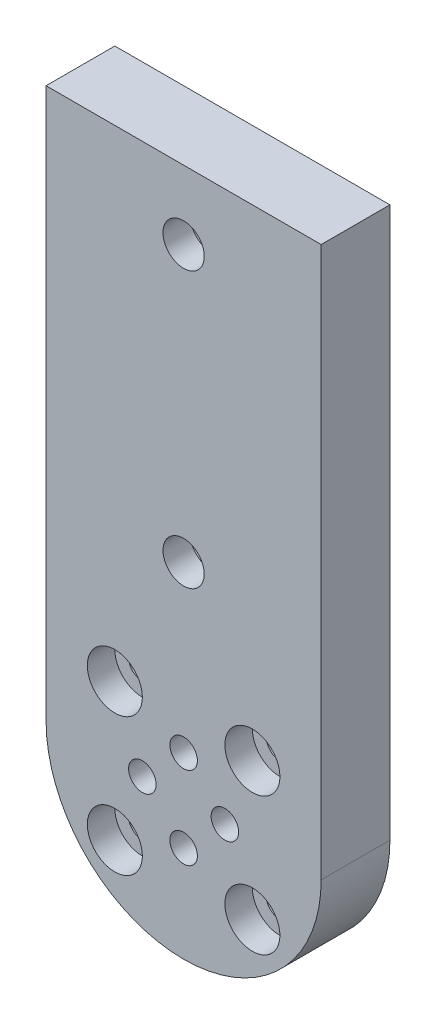
ISO-10303-21;
HEADER;
FILE_DESCRIPTION(('STEP AP214'),'2;1');
FILE_NAME('part.step','',(''),(''),'','','');
FILE_SCHEMA(('AUTOMOTIVE_DESIGN { 1 0 10303 214 1 1 1 1 }'));
ENDSEC;
DATA;
#1=APPLICATION_CONTEXT('core data for automotive mechanical design processes');
#2=APPLICATION_PROTOCOL_DEFINITION('international standard','automotive_design',2000,#1);
#3=PRODUCT_CONTEXT('',#1,'mechanical');
#4=PRODUCT('Part','Part','',(#3));
#5=PRODUCT_RELATED_PRODUCT_CATEGORY('part','',(#4));
#6=PRODUCT_DEFINITION_FORMATION('','',#4);
#7=PRODUCT_DEFINITION_CONTEXT('part definition',#1,'design');
#8=PRODUCT_DEFINITION('design','',#6,#7);
#9=PRODUCT_DEFINITION_SHAPE('','',#8);
#10=(LENGTH_UNIT() NAMED_UNIT(*) SI_UNIT(.MILLI.,.METRE.));
#11=(NAMED_UNIT(*) PLANE_ANGLE_UNIT() SI_UNIT($,.RADIAN.));
#12=(NAMED_UNIT(*) SI_UNIT($,.STERADIAN.) SOLID_ANGLE_UNIT());
#13=UNCERTAINTY_MEASURE_WITH_UNIT(LENGTH_MEASURE(1.E-05),#10,'distance_accuracy_value','');
#14=(GEOMETRIC_REPRESENTATION_CONTEXT(3) GLOBAL_UNCERTAINTY_ASSIGNED_CONTEXT((#13)) GLOBAL_UNIT_ASSIGNED_CONTEXT((#10,
#11,#12)) REPRESENTATION_CONTEXT('',''));
#15=CARTESIAN_POINT('',(0.,0.,0.));
#16=DIRECTION('',(0.,0.,1.));
#17=DIRECTION('',(1.,0.,0.));
#18=AXIS2_PLACEMENT_3D('',#15,#16,#17);
#19=CARTESIAN_POINT('',(0.,15.,5.));
#20=DIRECTION('',(0.,0.,-1.));
#21=DIRECTION('',(-1.,0.,0.));
#22=AXIS2_PLACEMENT_3D('',#19,#20,#21);
#23=CYLINDRICAL_SURFACE('',#22,1.5);
#24=CARTESIAN_POINT('',(0.,15.,5.));
#25=DIRECTION('',(0.,0.,1.));
#26=DIRECTION('',(1.,0.,0.));
#27=AXIS2_PLACEMENT_3D('',#24,#25,#26);
#28=CIRCLE('',#27,1.5);
#29=CARTESIAN_POINT('',(1.5,15.,5.));
#30=VERTEX_POINT('',#29);
#31=EDGE_CURVE('E104',#30,#30,#28,.T.);
#32=ORIENTED_EDGE('',*,*,#31,.T.);
#33=EDGE_LOOP('',(#32));
#34=FACE_BOUND('',#33,.T.);
#35=CARTESIAN_POINT('',(0.,15.,3.));
#36=DIRECTION('',(0.,0.,-1.));
#37=DIRECTION('',(-1.,0.,0.));
#38=AXIS2_PLACEMENT_3D('',#35,#36,#37);
#39=CIRCLE('',#38,1.5);
#40=CARTESIAN_POINT('',(-1.5,15.,3.));
#41=VERTEX_POINT('',#40);
#42=EDGE_CURVE('E43',#41,#41,#39,.T.);
#43=ORIENTED_EDGE('',*,*,#42,.T.);
#44=EDGE_LOOP('',(#43));
#45=FACE_BOUND('',#44,.T.);
#46=ADVANCED_FACE('F39',(#34,#45),#23,.F.);
#47=CARTESIAN_POINT('',(0.,35.,5.));
#48=DIRECTION('',(0.,0.,-1.));
#49=DIRECTION('',(-1.,0.,0.));
#50=AXIS2_PLACEMENT_3D('',#47,#48,#49);
#51=CYLINDRICAL_SURFACE('',#50,1.5);
#52=CARTESIAN_POINT('',(0.,35.,5.));
#53=DIRECTION('',(0.,0.,1.));
#54=DIRECTION('',(1.,0.,0.));
#55=AXIS2_PLACEMENT_3D('',#52,#53,#54);
#56=CIRCLE('',#55,1.5);
#57=CARTESIAN_POINT('',(1.5,35.,5.));
#58=VERTEX_POINT('',#57);
#59=EDGE_CURVE('E110',#58,#58,#56,.T.);
#60=ORIENTED_EDGE('',*,*,#59,.T.);
#61=EDGE_LOOP('',(#60));
#62=FACE_BOUND('',#61,.T.);
#63=CARTESIAN_POINT('',(0.,35.,3.));
#64=DIRECTION('',(0.,0.,-1.));
#65=DIRECTION('',(-1.,0.,0.));
#66=AXIS2_PLACEMENT_3D('',#63,#64,#65);
#67=CIRCLE('',#66,1.5);
#68=CARTESIAN_POINT('',(-1.5,35.,3.));
#69=VERTEX_POINT('',#68);
#70=EDGE_CURVE('E147',#69,#69,#67,.T.);
#71=ORIENTED_EDGE('',*,*,#70,.T.);
#72=EDGE_LOOP('',(#71));
#73=FACE_BOUND('',#72,.T.);
#74=ADVANCED_FACE('F234',(#62,#73),#51,.F.);
#75=CARTESIAN_POINT('',(-5.,5.,5.));
#76=DIRECTION('',(0.,0.,-1.));
#77=DIRECTION('',(-1.,0.,0.));
#78=AXIS2_PLACEMENT_3D('',#75,#76,#77);
#79=CYLINDRICAL_SURFACE('',#78,1.);
#80=CARTESIAN_POINT('',(-5.,5.,0.));
#81=DIRECTION('',(0.,0.,1.));
#82=DIRECTION('',(1.,0.,0.));
#83=AXIS2_PLACEMENT_3D('',#80,#81,#82);
#84=CIRCLE('',#83,1.);
#85=CARTESIAN_POINT('',(-4.,5.,0.));
#86=VERTEX_POINT('',#85);
#87=EDGE_CURVE('E123',#86,#86,#84,.T.);
#88=ORIENTED_EDGE('',*,*,#87,.F.);
#89=EDGE_LOOP('',(#88));
#90=FACE_BOUND('',#89,.T.);
#91=CARTESIAN_POINT('',(-5.,5.,3.));
#92=DIRECTION('',(0.,0.,1.));
#93=DIRECTION('',(1.,0.,0.));
#94=AXIS2_PLACEMENT_3D('',#91,#92,#93);
#95=CIRCLE('',#94,1.);
#96=CARTESIAN_POINT('',(-4.,5.,3.));
#97=VERTEX_POINT('',#96);
#98=EDGE_CURVE('E117',#97,#97,#95,.T.);
#99=ORIENTED_EDGE('',*,*,#98,.T.);
#100=EDGE_LOOP('',(#99));
#101=FACE_BOUND('',#100,.T.);
#102=ADVANCED_FACE('F241',(#90,#101),#79,.F.);
#103=CARTESIAN_POINT('',(5.,5.,5.));
#104=DIRECTION('',(0.,0.,-1.));
#105=DIRECTION('',(-1.,0.,0.));
#106=AXIS2_PLACEMENT_3D('',#103,#104,#105);
#107=CYLINDRICAL_SURFACE('',#106,1.);
#108=CARTESIAN_POINT('',(5.,5.,0.));
#109=DIRECTION('',(0.,0.,1.));
#110=DIRECTION('',(1.,0.,0.));
#111=AXIS2_PLACEMENT_3D('',#108,#109,#110);
#112=CIRCLE('',#111,1.);
#113=CARTESIAN_POINT('',(6.,5.,0.));
#114=VERTEX_POINT('',#113);
#115=EDGE_CURVE('E120',#114,#114,#112,.T.);
#116=ORIENTED_EDGE('',*,*,#115,.F.);
#117=EDGE_LOOP('',(#116));
#118=FACE_BOUND('',#117,.T.);
#119=CARTESIAN_POINT('',(5.,5.,3.));
#120=DIRECTION('',(0.,0.,1.));
#121=DIRECTION('',(1.,0.,0.));
#122=AXIS2_PLACEMENT_3D('',#119,#120,#121);
#123=CIRCLE('',#122,1.);
#124=CARTESIAN_POINT('',(6.,5.,3.));
#125=VERTEX_POINT('',#124);
#126=EDGE_CURVE('E143',#125,#125,#123,.T.);
#127=ORIENTED_EDGE('',*,*,#126,.T.);
#128=EDGE_LOOP('',(#127));
#129=FACE_BOUND('',#128,.T.);
#130=ADVANCED_FACE('F255',(#118,#129),#107,.F.);
#131=CARTESIAN_POINT('',(-5.,-5.,5.));
#132=DIRECTION('',(0.,0.,-1.));
#133=DIRECTION('',(-1.,0.,0.));
#134=AXIS2_PLACEMENT_3D('',#131,#132,#133);
#135=CYLINDRICAL_SURFACE('',#134,1.);
#136=CARTESIAN_POINT('',(-5.,-5.,0.));
#137=DIRECTION('',(0.,0.,1.));
#138=DIRECTION('',(1.,0.,0.));
#139=AXIS2_PLACEMENT_3D('',#136,#137,#138);
#140=CIRCLE('',#139,1.);
#141=CARTESIAN_POINT('',(-4.,-5.,0.));
#142=VERTEX_POINT('',#141);
#143=EDGE_CURVE('E116',#142,#142,#140,.T.);
#144=ORIENTED_EDGE('',*,*,#143,.F.);
#145=EDGE_LOOP('',(#144));
#146=FACE_BOUND('',#145,.T.);
#147=CARTESIAN_POINT('',(-5.,-5.,3.));
#148=DIRECTION('',(0.,0.,1.));
#149=DIRECTION('',(1.,0.,0.));
#150=AXIS2_PLACEMENT_3D('',#147,#148,#149);
#151=CIRCLE('',#150,1.);
#152=CARTESIAN_POINT('',(-4.,-5.,3.));
#153=VERTEX_POINT('',#152);
#154=EDGE_CURVE('E139',#153,#153,#151,.T.);
#155=ORIENTED_EDGE('',*,*,#154,.T.);
#156=EDGE_LOOP('',(#155));
#157=FACE_BOUND('',#156,.T.);
#158=ADVANCED_FACE('F258',(#146,#157),#135,.F.);
#159=CARTESIAN_POINT('',(5.,-5.,5.));
#160=DIRECTION('',(0.,0.,-1.));
#161=DIRECTION('',(-1.,0.,0.));
#162=AXIS2_PLACEMENT_3D('',#159,#160,#161);
#163=CYLINDRICAL_SURFACE('',#162,1.);
#164=CARTESIAN_POINT('',(5.,-5.,0.));
#165=DIRECTION('',(0.,0.,1.));
#166=DIRECTION('',(1.,0.,0.));
#167=AXIS2_PLACEMENT_3D('',#164,#165,#166);
#168=CIRCLE('',#167,1.);
#169=CARTESIAN_POINT('',(6.,-5.,0.));
#170=VERTEX_POINT('',#169);
#171=EDGE_CURVE('E113',#170,#170,#168,.T.);
#172=ORIENTED_EDGE('',*,*,#171,.F.);
#173=EDGE_LOOP('',(#172));
#174=FACE_BOUND('',#173,.T.);
#175=CARTESIAN_POINT('',(5.,-5.,3.));
#176=DIRECTION('',(0.,0.,1.));
#177=DIRECTION('',(1.,0.,0.));
#178=AXIS2_PLACEMENT_3D('',#175,#176,#177);
#179=CIRCLE('',#178,1.);
#180=CARTESIAN_POINT('',(6.,-5.,3.));
#181=VERTEX_POINT('',#180);
#182=EDGE_CURVE('E136',#181,#181,#179,.T.);
#183=ORIENTED_EDGE('',*,*,#182,.T.);
#184=EDGE_LOOP('',(#183));
#185=FACE_BOUND('',#184,.T.);
#186=ADVANCED_FACE('F41',(#174,#185),#163,.F.);
#187=CARTESIAN_POINT('',(0.,0.,5.));
#188=DIRECTION('',(0.,0.,-1.));
#189=DIRECTION('',(-1.,0.,0.));
#190=AXIS2_PLACEMENT_3D('',#187,#188,#189);
#191=CYLINDRICAL_SURFACE('',#190,10.);
#192=CARTESIAN_POINT('',(0.,0.,0.));
#193=DIRECTION('',(0.,0.,1.));
#194=DIRECTION('',(1.,0.,0.));
#195=AXIS2_PLACEMENT_3D('',#192,#193,#194);
#196=CIRCLE('',#195,10.);
#197=CARTESIAN_POINT('',(-10.,0.,0.));
#198=VERTEX_POINT('',#197);
#199=CARTESIAN_POINT('',(10.,0.,0.));
#200=VERTEX_POINT('',#199);
#201=EDGE_CURVE('E126',#198,#200,#196,.T.);
#202=ORIENTED_EDGE('',*,*,#201,.T.);
#203=DIRECTION('',(0.,0.,-1.));
#204=VECTOR('',#203,1.);
#205=CARTESIAN_POINT('',(10.,0.,5.));
#206=LINE('',#205,#204);
#207=CARTESIAN_POINT('',(10.,0.,5.));
#208=VERTEX_POINT('',#207);
#209=EDGE_CURVE('E11',#208,#200,#206,.T.);
#210=ORIENTED_EDGE('',*,*,#209,.F.);
#211=CARTESIAN_POINT('',(0.,0.,5.));
#212=DIRECTION('',(0.,0.,1.));
#213=DIRECTION('',(1.,0.,0.));
#214=AXIS2_PLACEMENT_3D('',#211,#212,#213);
#215=CIRCLE('',#214,10.);
#216=CARTESIAN_POINT('',(-10.,0.,5.));
#217=VERTEX_POINT('',#216);
#218=EDGE_CURVE('E92',#217,#208,#215,.T.);
#219=ORIENTED_EDGE('',*,*,#218,.F.);
#220=DIRECTION('',(0.,0.,-1.));
#221=VECTOR('',#220,1.);
#222=CARTESIAN_POINT('',(-10.,0.,5.));
#223=LINE('',#222,#221);
#224=EDGE_CURVE('E58',#217,#198,#223,.T.);
#225=ORIENTED_EDGE('',*,*,#224,.T.);
#226=EDGE_LOOP('',(#202,#210,#219,#225));
#227=FACE_BOUND('',#226,.T.);
#228=ADVANCED_FACE('F250',(#227),#191,.T.);
#229=CARTESIAN_POINT('',(10.,0.,5.));
#230=DIRECTION('',(-1.,0.,0.));
#231=DIRECTION('',(0.,0.,1.));
#232=AXIS2_PLACEMENT_3D('',#229,#230,#231);
#233=PLANE('',#232);
#234=DIRECTION('',(0.,1.,0.));
#235=VECTOR('',#234,1.);
#236=CARTESIAN_POINT('',(10.,0.,0.));
#237=LINE('',#236,#235);
#238=CARTESIAN_POINT('',(10.,40.,0.));
#239=VERTEX_POINT('',#238);
#240=EDGE_CURVE('E97',#200,#239,#237,.T.);
#241=ORIENTED_EDGE('',*,*,#240,.T.);
#242=DIRECTION('',(0.,0.,-1.));
#243=VECTOR('',#242,1.);
#244=CARTESIAN_POINT('',(10.,40.,5.));
#245=LINE('',#244,#243);
#246=CARTESIAN_POINT('',(10.,40.,5.));
#247=VERTEX_POINT('',#246);
#248=EDGE_CURVE('E49',#247,#239,#245,.T.);
#249=ORIENTED_EDGE('',*,*,#248,.F.);
#250=DIRECTION('',(0.,1.,0.));
#251=VECTOR('',#250,1.);
#252=CARTESIAN_POINT('',(10.,0.,5.));
#253=LINE('',#252,#251);
#254=EDGE_CURVE('E83',#208,#247,#253,.T.);
#255=ORIENTED_EDGE('',*,*,#254,.F.);
#256=ORIENTED_EDGE('',*,*,#209,.T.);
#257=EDGE_LOOP('',(#241,#249,#255,#256));
#258=FACE_BOUND('',#257,.T.);
#259=ADVANCED_FACE('F96',(#258),#233,.F.);
#260=CARTESIAN_POINT('',(0.,40.,5.));
#261=DIRECTION('',(0.,1.,0.));
#262=DIRECTION('',(0.,0.,1.));
#263=AXIS2_PLACEMENT_3D('',#260,#261,#262);
#264=PLANE('',#263);
#265=DIRECTION('',(1.,0.,0.));
#266=VECTOR('',#265,1.);
#267=CARTESIAN_POINT('',(0.,40.,0.));
#268=LINE('',#267,#266);
#269=CARTESIAN_POINT('',(-10.,40.,0.));
#270=VERTEX_POINT('',#269);
#271=EDGE_CURVE('E129',#270,#239,#268,.T.);
#272=ORIENTED_EDGE('',*,*,#271,.F.);
#273=DIRECTION('',(0.,0.,-1.));
#274=VECTOR('',#273,1.);
#275=CARTESIAN_POINT('',(-10.,40.,5.));
#276=LINE('',#275,#274);
#277=CARTESIAN_POINT('',(-10.,40.,5.));
#278=VERTEX_POINT('',#277);
#279=EDGE_CURVE('E72',#278,#270,#276,.T.);
#280=ORIENTED_EDGE('',*,*,#279,.F.);
#281=DIRECTION('',(1.,0.,0.));
#282=VECTOR('',#281,1.);
#283=CARTESIAN_POINT('',(0.,40.,5.));
#284=LINE('',#283,#282);
#285=EDGE_CURVE('E91',#278,#247,#284,.T.);
#286=ORIENTED_EDGE('',*,*,#285,.T.);
#287=ORIENTED_EDGE('',*,*,#248,.T.);
#288=EDGE_LOOP('',(#272,#280,#286,#287));
#289=FACE_BOUND('',#288,.T.);
#290=ADVANCED_FACE('F101',(#289),#264,.T.);
#291=CARTESIAN_POINT('',(-10.,0.,5.));
#292=DIRECTION('',(-1.,0.,0.));
#293=DIRECTION('',(0.,0.,1.));
#294=AXIS2_PLACEMENT_3D('',#291,#292,#293);
#295=PLANE('',#294);
#296=DIRECTION('',(0.,1.,0.));
#297=VECTOR('',#296,1.);
#298=CARTESIAN_POINT('',(-10.,0.,0.));
#299=LINE('',#298,#297);
#300=EDGE_CURVE('E131',#198,#270,#299,.T.);
#301=ORIENTED_EDGE('',*,*,#300,.F.);
#302=ORIENTED_EDGE('',*,*,#224,.F.);
#303=DIRECTION('',(0.,1.,0.));
#304=VECTOR('',#303,1.);
#305=CARTESIAN_POINT('',(-10.,0.,5.));
#306=LINE('',#305,#304);
#307=EDGE_CURVE('E102',#217,#278,#306,.T.);
#308=ORIENTED_EDGE('',*,*,#307,.T.);
#309=ORIENTED_EDGE('',*,*,#279,.T.);
#310=EDGE_LOOP('',(#301,#302,#308,#309));
#311=FACE_BOUND('',#310,.T.);
#312=ADVANCED_FACE('F219',(#311),#295,.T.);
#313=CARTESIAN_POINT('',(0.,0.,5.));
#314=DIRECTION('',(0.,0.,1.));
#315=DIRECTION('',(1.,0.,0.));
#316=AXIS2_PLACEMENT_3D('',#313,#314,#315);
#317=PLANE('',#316);
#318=CARTESIAN_POINT('',(5.,5.,5.));
#319=DIRECTION('',(0.,0.,1.));
#320=DIRECTION('',(1.,0.,0.));
#321=AXIS2_PLACEMENT_3D('',#318,#319,#320);
#322=CIRCLE('',#321,2.);
#323=CARTESIAN_POINT('',(7.,5.,5.));
#324=VERTEX_POINT('',#323);
#325=EDGE_CURVE('E186',#324,#324,#322,.T.);
#326=ORIENTED_EDGE('',*,*,#325,.F.);
#327=EDGE_LOOP('',(#326));
#328=FACE_BOUND('',#327,.T.);
#329=CARTESIAN_POINT('',(5.,-5.,5.));
#330=DIRECTION('',(0.,0.,1.));
#331=DIRECTION('',(1.,0.,0.));
#332=AXIS2_PLACEMENT_3D('',#329,#330,#331);
#333=CIRCLE('',#332,2.);
#334=CARTESIAN_POINT('',(7.,-5.,5.));
#335=VERTEX_POINT('',#334);
#336=EDGE_CURVE('E193',#335,#335,#333,.T.);
#337=ORIENTED_EDGE('',*,*,#336,.F.);
#338=EDGE_LOOP('',(#337));
#339=FACE_BOUND('',#338,.T.);
#340=CARTESIAN_POINT('',(-5.,-5.,5.));
#341=DIRECTION('',(0.,0.,1.));
#342=DIRECTION('',(1.,0.,0.));
#343=AXIS2_PLACEMENT_3D('',#340,#341,#342);
#344=CIRCLE('',#343,2.);
#345=CARTESIAN_POINT('',(-3.,-5.,5.));
#346=VERTEX_POINT('',#345);
#347=EDGE_CURVE('E199',#346,#346,#344,.T.);
#348=ORIENTED_EDGE('',*,*,#347,.F.);
#349=EDGE_LOOP('',(#348));
#350=FACE_BOUND('',#349,.T.);
#351=CARTESIAN_POINT('',(0.,3.,5.));
#352=DIRECTION('',(0.,0.,1.));
#353=DIRECTION('',(1.,0.,0.));
#354=AXIS2_PLACEMENT_3D('',#351,#352,#353);
#355=CIRCLE('',#354,1.);
#356=CARTESIAN_POINT('',(1.,3.,5.));
#357=VERTEX_POINT('',#356);
#358=EDGE_CURVE('E205',#357,#357,#355,.T.);
#359=ORIENTED_EDGE('',*,*,#358,.F.);
#360=EDGE_LOOP('',(#359));
#361=FACE_BOUND('',#360,.T.);
#362=CARTESIAN_POINT('',(-3.,0.,5.));
#363=DIRECTION('',(0.,0.,1.));
#364=DIRECTION('',(1.,0.,0.));
#365=AXIS2_PLACEMENT_3D('',#362,#363,#364);
#366=CIRCLE('',#365,1.);
#367=CARTESIAN_POINT('',(-2.,0.,5.));
#368=VERTEX_POINT('',#367);
#369=EDGE_CURVE('E168',#368,#368,#366,.T.);
#370=ORIENTED_EDGE('',*,*,#369,.F.);
#371=EDGE_LOOP('',(#370));
#372=FACE_BOUND('',#371,.T.);
#373=CARTESIAN_POINT('',(3.,0.,5.));
#374=DIRECTION('',(0.,0.,1.));
#375=DIRECTION('',(1.,0.,0.));
#376=AXIS2_PLACEMENT_3D('',#373,#374,#375);
#377=CIRCLE('',#376,1.);
#378=CARTESIAN_POINT('',(4.,0.,5.));
#379=VERTEX_POINT('',#378);
#380=EDGE_CURVE('E175',#379,#379,#377,.T.);
#381=ORIENTED_EDGE('',*,*,#380,.F.);
#382=EDGE_LOOP('',(#381));
#383=FACE_BOUND('',#382,.T.);
#384=CARTESIAN_POINT('',(0.,-3.,5.));
#385=DIRECTION('',(0.,0.,1.));
#386=DIRECTION('',(1.,0.,0.));
#387=AXIS2_PLACEMENT_3D('',#384,#385,#386);
#388=CIRCLE('',#387,1.);
#389=CARTESIAN_POINT('',(1.,-3.,5.));
#390=VERTEX_POINT('',#389);
#391=EDGE_CURVE('E181',#390,#390,#388,.T.);
#392=ORIENTED_EDGE('',*,*,#391,.F.);
#393=EDGE_LOOP('',(#392));
#394=FACE_BOUND('',#393,.T.);
#395=CARTESIAN_POINT('',(-5.,5.,5.));
#396=DIRECTION('',(0.,0.,1.));
#397=DIRECTION('',(1.,0.,0.));
#398=AXIS2_PLACEMENT_3D('',#395,#396,#397);
#399=CIRCLE('',#398,2.);
#400=CARTESIAN_POINT('',(-3.,5.,5.));
#401=VERTEX_POINT('',#400);
#402=EDGE_CURVE('E189',#401,#401,#399,.T.);
#403=ORIENTED_EDGE('',*,*,#402,.F.);
#404=EDGE_LOOP('',(#403));
#405=FACE_BOUND('',#404,.T.);
#406=ORIENTED_EDGE('',*,*,#218,.T.);
#407=ORIENTED_EDGE('',*,*,#254,.T.);
#408=ORIENTED_EDGE('',*,*,#285,.F.);
#409=ORIENTED_EDGE('',*,*,#307,.F.);
#410=EDGE_LOOP('',(#406,#407,#408,#409));
#411=FACE_BOUND('',#410,.T.);
#412=ORIENTED_EDGE('',*,*,#31,.F.);
#413=EDGE_LOOP('',(#412));
#414=FACE_BOUND('',#413,.T.);
#415=ORIENTED_EDGE('',*,*,#59,.F.);
#416=EDGE_LOOP('',(#415));
#417=FACE_BOUND('',#416,.T.);
#418=ADVANCED_FACE('F87',(#328,#339,#350,#361,#372,#383,#394,#405,#411,#414,#417),#317,.T.);
#419=CARTESIAN_POINT('',(0.,0.,0.));
#420=DIRECTION('',(0.,0.,1.));
#421=DIRECTION('',(1.,0.,0.));
#422=AXIS2_PLACEMENT_3D('',#419,#420,#421);
#423=PLANE('',#422);
#424=CARTESIAN_POINT('',(0.,35.,0.));
#425=DIRECTION('',(0.,0.,-1.));
#426=DIRECTION('',(-1.,0.,0.));
#427=AXIS2_PLACEMENT_3D('',#424,#425,#426);
#428=CIRCLE('',#427,3.5);
#429=CARTESIAN_POINT('',(-3.5,35.,0.));
#430=VERTEX_POINT('',#429);
#431=EDGE_CURVE('E155',#430,#430,#428,.T.);
#432=ORIENTED_EDGE('',*,*,#431,.F.);
#433=EDGE_LOOP('',(#432));
#434=FACE_BOUND('',#433,.T.);
#435=CARTESIAN_POINT('',(0.,15.,0.));
#436=DIRECTION('',(0.,0.,-1.));
#437=DIRECTION('',(-1.,0.,0.));
#438=AXIS2_PLACEMENT_3D('',#435,#436,#437);
#439=CIRCLE('',#438,3.5);
#440=CARTESIAN_POINT('',(-3.5,15.,0.));
#441=VERTEX_POINT('',#440);
#442=EDGE_CURVE('E160',#441,#441,#439,.T.);
#443=ORIENTED_EDGE('',*,*,#442,.F.);
#444=EDGE_LOOP('',(#443));
#445=FACE_BOUND('',#444,.T.);
#446=ORIENTED_EDGE('',*,*,#171,.T.);
#447=EDGE_LOOP('',(#446));
#448=FACE_BOUND('',#447,.T.);
#449=ORIENTED_EDGE('',*,*,#143,.T.);
#450=EDGE_LOOP('',(#449));
#451=FACE_BOUND('',#450,.T.);
#452=ORIENTED_EDGE('',*,*,#115,.T.);
#453=EDGE_LOOP('',(#452));
#454=FACE_BOUND('',#453,.T.);
#455=ORIENTED_EDGE('',*,*,#87,.T.);
#456=EDGE_LOOP('',(#455));
#457=FACE_BOUND('',#456,.T.);
#458=ORIENTED_EDGE('',*,*,#201,.F.);
#459=ORIENTED_EDGE('',*,*,#300,.T.);
#460=ORIENTED_EDGE('',*,*,#271,.T.);
#461=ORIENTED_EDGE('',*,*,#240,.F.);
#462=EDGE_LOOP('',(#458,#459,#460,#461));
#463=FACE_BOUND('',#462,.T.);
#464=ADVANCED_FACE('F218',(#434,#445,#448,#451,#454,#457,#463),#423,.F.);
#465=CARTESIAN_POINT('',(-5.,5.,3.));
#466=DIRECTION('',(0.,0.,1.));
#467=DIRECTION('',(1.,0.,0.));
#468=AXIS2_PLACEMENT_3D('',#465,#466,#467);
#469=CYLINDRICAL_SURFACE('',#468,2.);
#470=CARTESIAN_POINT('',(-5.,5.,3.));
#471=DIRECTION('',(0.,0.,1.));
#472=DIRECTION('',(1.,0.,0.));
#473=AXIS2_PLACEMENT_3D('',#470,#471,#472);
#474=CIRCLE('',#473,2.);
#475=CARTESIAN_POINT('',(-3.,5.,3.));
#476=VERTEX_POINT('',#475);
#477=EDGE_CURVE('E140',#476,#476,#474,.T.);
#478=ORIENTED_EDGE('',*,*,#477,.F.);
#479=EDGE_LOOP('',(#478));
#480=FACE_BOUND('',#479,.T.);
#481=ORIENTED_EDGE('',*,*,#402,.T.);
#482=EDGE_LOOP('',(#481));
#483=FACE_BOUND('',#482,.T.);
#484=ADVANCED_FACE('F215',(#480,#483),#469,.F.);
#485=CARTESIAN_POINT('',(-5.,5.,3.));
#486=DIRECTION('',(0.,0.,1.));
#487=DIRECTION('',(1.,0.,0.));
#488=AXIS2_PLACEMENT_3D('',#485,#486,#487);
#489=PLANE('',#488);
#490=ORIENTED_EDGE('',*,*,#98,.F.);
#491=EDGE_LOOP('',(#490));
#492=FACE_BOUND('',#491,.T.);
#493=ORIENTED_EDGE('',*,*,#477,.T.);
#494=EDGE_LOOP('',(#493));
#495=FACE_BOUND('',#494,.T.);
#496=ADVANCED_FACE('F296',(#492,#495),#489,.T.);
#497=CARTESIAN_POINT('',(0.,-3.,3.));
#498=DIRECTION('',(0.,0.,1.));
#499=DIRECTION('',(1.,0.,0.));
#500=AXIS2_PLACEMENT_3D('',#497,#498,#499);
#501=CYLINDRICAL_SURFACE('',#500,1.);
#502=CARTESIAN_POINT('',(0.,-3.,3.));
#503=DIRECTION('',(0.,0.,1.));
#504=DIRECTION('',(1.,0.,0.));
#505=AXIS2_PLACEMENT_3D('',#502,#503,#504);
#506=CIRCLE('',#505,1.);
#507=CARTESIAN_POINT('',(1.,-3.,3.));
#508=VERTEX_POINT('',#507);
#509=EDGE_CURVE('E153',#508,#508,#506,.T.);
#510=ORIENTED_EDGE('',*,*,#509,.F.);
#511=EDGE_LOOP('',(#510));
#512=FACE_BOUND('',#511,.T.);
#513=ORIENTED_EDGE('',*,*,#391,.T.);
#514=EDGE_LOOP('',(#513));
#515=FACE_BOUND('',#514,.T.);
#516=ADVANCED_FACE('F293',(#512,#515),#501,.F.);
#517=CARTESIAN_POINT('',(0.,-3.,3.));
#518=DIRECTION('',(0.,0.,1.));
#519=DIRECTION('',(1.,0.,0.));
#520=AXIS2_PLACEMENT_3D('',#517,#518,#519);
#521=PLANE('',#520);
#522=ORIENTED_EDGE('',*,*,#509,.T.);
#523=EDGE_LOOP('',(#522));
#524=FACE_BOUND('',#523,.T.);
#525=ADVANCED_FACE('F295',(#524),#521,.T.);
#526=CARTESIAN_POINT('',(3.,0.,3.));
#527=DIRECTION('',(0.,0.,1.));
#528=DIRECTION('',(1.,0.,0.));
#529=AXIS2_PLACEMENT_3D('',#526,#527,#528);
#530=CYLINDRICAL_SURFACE('',#529,1.);
#531=CARTESIAN_POINT('',(3.,0.,3.));
#532=DIRECTION('',(0.,0.,1.));
#533=DIRECTION('',(1.,0.,0.));
#534=AXIS2_PLACEMENT_3D('',#531,#532,#533);
#535=CIRCLE('',#534,1.);
#536=CARTESIAN_POINT('',(4.,0.,3.));
#537=VERTEX_POINT('',#536);
#538=EDGE_CURVE('E178',#537,#537,#535,.T.);
#539=ORIENTED_EDGE('',*,*,#538,.F.);
#540=EDGE_LOOP('',(#539));
#541=FACE_BOUND('',#540,.T.);
#542=ORIENTED_EDGE('',*,*,#380,.T.);
#543=EDGE_LOOP('',(#542));
#544=FACE_BOUND('',#543,.T.);
#545=ADVANCED_FACE('F303',(#541,#544),#530,.F.);
#546=CARTESIAN_POINT('',(3.,0.,3.));
#547=DIRECTION('',(0.,0.,1.));
#548=DIRECTION('',(1.,0.,0.));
#549=AXIS2_PLACEMENT_3D('',#546,#547,#548);
#550=PLANE('',#549);
#551=ORIENTED_EDGE('',*,*,#538,.T.);
#552=EDGE_LOOP('',(#551));
#553=FACE_BOUND('',#552,.T.);
#554=ADVANCED_FACE('F310',(#553),#550,.T.);
#555=CARTESIAN_POINT('',(-3.,0.,3.));
#556=DIRECTION('',(0.,0.,1.));
#557=DIRECTION('',(1.,0.,0.));
#558=AXIS2_PLACEMENT_3D('',#555,#556,#557);
#559=CYLINDRICAL_SURFACE('',#558,1.);
#560=CARTESIAN_POINT('',(-3.,0.,3.));
#561=DIRECTION('',(0.,0.,1.));
#562=DIRECTION('',(1.,0.,0.));
#563=AXIS2_PLACEMENT_3D('',#560,#561,#562);
#564=CIRCLE('',#563,1.);
#565=CARTESIAN_POINT('',(-2.,0.,3.));
#566=VERTEX_POINT('',#565);
#567=EDGE_CURVE('E172',#566,#566,#564,.T.);
#568=ORIENTED_EDGE('',*,*,#567,.F.);
#569=EDGE_LOOP('',(#568));
#570=FACE_BOUND('',#569,.T.);
#571=ORIENTED_EDGE('',*,*,#369,.T.);
#572=EDGE_LOOP('',(#571));
#573=FACE_BOUND('',#572,.T.);
#574=ADVANCED_FACE('F379',(#570,#573),#559,.F.);
#575=CARTESIAN_POINT('',(-3.,0.,3.));
#576=DIRECTION('',(0.,0.,1.));
#577=DIRECTION('',(1.,0.,0.));
#578=AXIS2_PLACEMENT_3D('',#575,#576,#577);
#579=PLANE('',#578);
#580=ORIENTED_EDGE('',*,*,#567,.T.);
#581=EDGE_LOOP('',(#580));
#582=FACE_BOUND('',#581,.T.);
#583=ADVANCED_FACE('F332',(#582),#579,.T.);
#584=CARTESIAN_POINT('',(0.,3.,3.));
#585=DIRECTION('',(0.,0.,1.));
#586=DIRECTION('',(1.,0.,0.));
#587=AXIS2_PLACEMENT_3D('',#584,#585,#586);
#588=CYLINDRICAL_SURFACE('',#587,1.);
#589=CARTESIAN_POINT('',(0.,3.,3.));
#590=DIRECTION('',(0.,0.,1.));
#591=DIRECTION('',(1.,0.,0.));
#592=AXIS2_PLACEMENT_3D('',#589,#590,#591);
#593=CIRCLE('',#592,1.);
#594=CARTESIAN_POINT('',(1.,3.,3.));
#595=VERTEX_POINT('',#594);
#596=EDGE_CURVE('E171',#595,#595,#593,.T.);
#597=ORIENTED_EDGE('',*,*,#596,.F.);
#598=EDGE_LOOP('',(#597));
#599=FACE_BOUND('',#598,.T.);
#600=ORIENTED_EDGE('',*,*,#358,.T.);
#601=EDGE_LOOP('',(#600));
#602=FACE_BOUND('',#601,.T.);
#603=ADVANCED_FACE('F329',(#599,#602),#588,.F.);
#604=CARTESIAN_POINT('',(0.,3.,3.));
#605=DIRECTION('',(0.,0.,1.));
#606=DIRECTION('',(1.,0.,0.));
#607=AXIS2_PLACEMENT_3D('',#604,#605,#606);
#608=PLANE('',#607);
#609=ORIENTED_EDGE('',*,*,#596,.T.);
#610=EDGE_LOOP('',(#609));
#611=FACE_BOUND('',#610,.T.);
#612=ADVANCED_FACE('F280',(#611),#608,.T.);
#613=CARTESIAN_POINT('',(-5.,-5.,3.));
#614=DIRECTION('',(0.,0.,1.));
#615=DIRECTION('',(1.,0.,0.));
#616=AXIS2_PLACEMENT_3D('',#613,#614,#615);
#617=CYLINDRICAL_SURFACE('',#616,2.);
#618=CARTESIAN_POINT('',(-5.,-5.,3.));
#619=DIRECTION('',(0.,0.,1.));
#620=DIRECTION('',(1.,0.,0.));
#621=AXIS2_PLACEMENT_3D('',#618,#619,#620);
#622=CIRCLE('',#621,2.);
#623=CARTESIAN_POINT('',(-3.,-5.,3.));
#624=VERTEX_POINT('',#623);
#625=EDGE_CURVE('E202',#624,#624,#622,.T.);
#626=ORIENTED_EDGE('',*,*,#625,.F.);
#627=EDGE_LOOP('',(#626));
#628=FACE_BOUND('',#627,.T.);
#629=ORIENTED_EDGE('',*,*,#347,.T.);
#630=EDGE_LOOP('',(#629));
#631=FACE_BOUND('',#630,.T.);
#632=ADVANCED_FACE('F274',(#628,#631),#617,.F.);
#633=CARTESIAN_POINT('',(-5.,-5.,3.));
#634=DIRECTION('',(0.,0.,1.));
#635=DIRECTION('',(1.,0.,0.));
#636=AXIS2_PLACEMENT_3D('',#633,#634,#635);
#637=PLANE('',#636);
#638=ORIENTED_EDGE('',*,*,#154,.F.);
#639=EDGE_LOOP('',(#638));
#640=FACE_BOUND('',#639,.T.);
#641=ORIENTED_EDGE('',*,*,#625,.T.);
#642=EDGE_LOOP('',(#641));
#643=FACE_BOUND('',#642,.T.);
#644=ADVANCED_FACE('F270',(#640,#643),#637,.T.);
#645=CARTESIAN_POINT('',(5.,-5.,3.));
#646=DIRECTION('',(0.,0.,1.));
#647=DIRECTION('',(1.,0.,0.));
#648=AXIS2_PLACEMENT_3D('',#645,#646,#647);
#649=CYLINDRICAL_SURFACE('',#648,2.);
#650=CARTESIAN_POINT('',(5.,-5.,3.));
#651=DIRECTION('',(0.,0.,1.));
#652=DIRECTION('',(1.,0.,0.));
#653=AXIS2_PLACEMENT_3D('',#650,#651,#652);
#654=CIRCLE('',#653,2.);
#655=CARTESIAN_POINT('',(7.,-5.,3.));
#656=VERTEX_POINT('',#655);
#657=EDGE_CURVE('E196',#656,#656,#654,.T.);
#658=ORIENTED_EDGE('',*,*,#657,.F.);
#659=EDGE_LOOP('',(#658));
#660=FACE_BOUND('',#659,.T.);
#661=ORIENTED_EDGE('',*,*,#336,.T.);
#662=EDGE_LOOP('',(#661));
#663=FACE_BOUND('',#662,.T.);
#664=ADVANCED_FACE('F273',(#660,#663),#649,.F.);
#665=CARTESIAN_POINT('',(5.,-5.,3.));
#666=DIRECTION('',(0.,0.,1.));
#667=DIRECTION('',(1.,0.,0.));
#668=AXIS2_PLACEMENT_3D('',#665,#666,#667);
#669=PLANE('',#668);
#670=ORIENTED_EDGE('',*,*,#182,.F.);
#671=EDGE_LOOP('',(#670));
#672=FACE_BOUND('',#671,.T.);
#673=ORIENTED_EDGE('',*,*,#657,.T.);
#674=EDGE_LOOP('',(#673));
#675=FACE_BOUND('',#674,.T.);
#676=ADVANCED_FACE('F317',(#672,#675),#669,.T.);
#677=CARTESIAN_POINT('',(5.,5.,3.));
#678=DIRECTION('',(0.,0.,1.));
#679=DIRECTION('',(1.,0.,0.));
#680=AXIS2_PLACEMENT_3D('',#677,#678,#679);
#681=CYLINDRICAL_SURFACE('',#680,2.);
#682=CARTESIAN_POINT('',(5.,5.,3.));
#683=DIRECTION('',(0.,0.,1.));
#684=DIRECTION('',(1.,0.,0.));
#685=AXIS2_PLACEMENT_3D('',#682,#683,#684);
#686=CIRCLE('',#685,2.);
#687=CARTESIAN_POINT('',(7.,5.,3.));
#688=VERTEX_POINT('',#687);
#689=EDGE_CURVE('E190',#688,#688,#686,.T.);
#690=ORIENTED_EDGE('',*,*,#689,.F.);
#691=EDGE_LOOP('',(#690));
#692=FACE_BOUND('',#691,.T.);
#693=ORIENTED_EDGE('',*,*,#325,.T.);
#694=EDGE_LOOP('',(#693));
#695=FACE_BOUND('',#694,.T.);
#696=ADVANCED_FACE('F313',(#692,#695),#681,.F.);
#697=CARTESIAN_POINT('',(5.,5.,3.));
#698=DIRECTION('',(0.,0.,1.));
#699=DIRECTION('',(1.,0.,0.));
#700=AXIS2_PLACEMENT_3D('',#697,#698,#699);
#701=PLANE('',#700);
#702=ORIENTED_EDGE('',*,*,#126,.F.);
#703=EDGE_LOOP('',(#702));
#704=FACE_BOUND('',#703,.T.);
#705=ORIENTED_EDGE('',*,*,#689,.T.);
#706=EDGE_LOOP('',(#705));
#707=FACE_BOUND('',#706,.T.);
#708=ADVANCED_FACE('F316',(#704,#707),#701,.T.);
#709=CARTESIAN_POINT('',(0.,15.,3.));
#710=DIRECTION('',(0.,0.,-1.));
#711=DIRECTION('',(-1.,0.,0.));
#712=AXIS2_PLACEMENT_3D('',#709,#710,#711);
#713=CYLINDRICAL_SURFACE('',#712,3.5);
#714=CARTESIAN_POINT('',(0.,15.,3.));
#715=DIRECTION('',(0.,0.,-1.));
#716=DIRECTION('',(-1.,0.,0.));
#717=AXIS2_PLACEMENT_3D('',#714,#715,#716);
#718=CIRCLE('',#717,3.5);
#719=CARTESIAN_POINT('',(-3.5,15.,3.));
#720=VERTEX_POINT('',#719);
#721=EDGE_CURVE('E165',#720,#720,#718,.T.);
#722=ORIENTED_EDGE('',*,*,#721,.F.);
#723=EDGE_LOOP('',(#722));
#724=FACE_BOUND('',#723,.T.);
#725=ORIENTED_EDGE('',*,*,#442,.T.);
#726=EDGE_LOOP('',(#725));
#727=FACE_BOUND('',#726,.T.);
#728=ADVANCED_FACE('F321',(#724,#727),#713,.F.);
#729=CARTESIAN_POINT('',(0.,15.,3.));
#730=DIRECTION('',(0.,0.,-1.));
#731=DIRECTION('',(-1.,0.,0.));
#732=AXIS2_PLACEMENT_3D('',#729,#730,#731);
#733=PLANE('',#732);
#734=ORIENTED_EDGE('',*,*,#42,.F.);
#735=EDGE_LOOP('',(#734));
#736=FACE_BOUND('',#735,.T.);
#737=ORIENTED_EDGE('',*,*,#721,.T.);
#738=EDGE_LOOP('',(#737));
#739=FACE_BOUND('',#738,.T.);
#740=ADVANCED_FACE('F475',(#736,#739),#733,.T.);
#741=CARTESIAN_POINT('',(0.,35.,3.));
#742=DIRECTION('',(0.,0.,-1.));
#743=DIRECTION('',(-1.,0.,0.));
#744=AXIS2_PLACEMENT_3D('',#741,#742,#743);
#745=CYLINDRICAL_SURFACE('',#744,3.5);
#746=CARTESIAN_POINT('',(0.,35.,3.));
#747=DIRECTION('',(0.,0.,-1.));
#748=DIRECTION('',(-1.,0.,0.));
#749=AXIS2_PLACEMENT_3D('',#746,#747,#748);
#750=CIRCLE('',#749,3.5);
#751=CARTESIAN_POINT('',(-3.5,35.,3.));
#752=VERTEX_POINT('',#751);
#753=EDGE_CURVE('E149',#752,#752,#750,.T.);
#754=ORIENTED_EDGE('',*,*,#753,.F.);
#755=EDGE_LOOP('',(#754));
#756=FACE_BOUND('',#755,.T.);
#757=ORIENTED_EDGE('',*,*,#431,.T.);
#758=EDGE_LOOP('',(#757));
#759=FACE_BOUND('',#758,.T.);
#760=ADVANCED_FACE('F482',(#756,#759),#745,.F.);
#761=CARTESIAN_POINT('',(0.,35.,3.));
#762=DIRECTION('',(0.,0.,-1.));
#763=DIRECTION('',(-1.,0.,0.));
#764=AXIS2_PLACEMENT_3D('',#761,#762,#763);
#765=PLANE('',#764);
#766=ORIENTED_EDGE('',*,*,#70,.F.);
#767=EDGE_LOOP('',(#766));
#768=FACE_BOUND('',#767,.T.);
#769=ORIENTED_EDGE('',*,*,#753,.T.);
#770=EDGE_LOOP('',(#769));
#771=FACE_BOUND('',#770,.T.);
#772=ADVANCED_FACE('F490',(#768,#771),#765,.T.);
#773=CLOSED_SHELL('',(#46,#74,#102,#130,#158,#186,#228,#259,#290,#312,#418,#464,#484,#496,#516,
#525,#545,#554,#574,#583,#603,#612,#632,#644,#664,#676,#696,#708,#728,#740,#760,#772));
#774=MANIFOLD_SOLID_BREP('B2',#773);
#775=ADVANCED_BREP_SHAPE_REPRESENTATION('',(#18,#774),#14);
#776=SHAPE_DEFINITION_REPRESENTATION(#9,#775);
ENDSEC;
END-ISO-10303-21;
